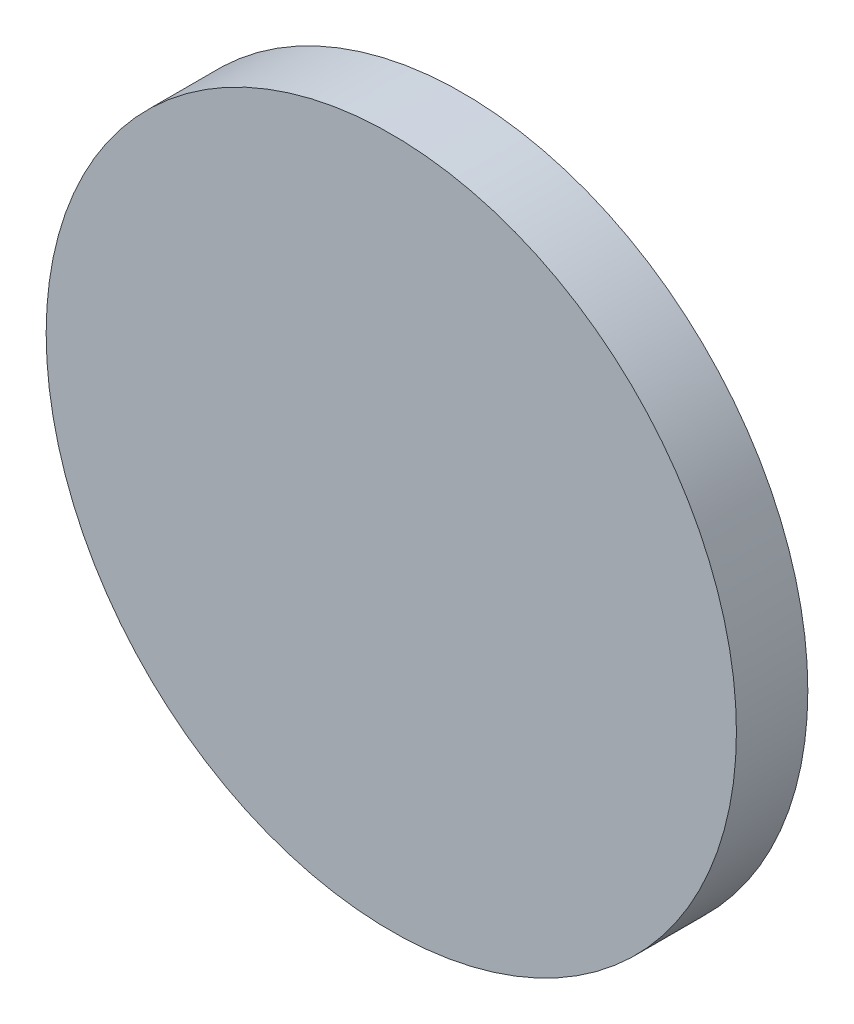
ISO-10303-21;
HEADER;
FILE_DESCRIPTION(('STEP AP214'),'2;1');
FILE_NAME('part.step','',(''),(''),'','','');
FILE_SCHEMA(('AUTOMOTIVE_DESIGN { 1 0 10303 214 1 1 1 1 }'));
ENDSEC;
DATA;
#1=APPLICATION_CONTEXT('core data for automotive mechanical design processes');
#2=APPLICATION_PROTOCOL_DEFINITION('international standard','automotive_design',2000,#1);
#3=PRODUCT_CONTEXT('',#1,'mechanical');
#4=PRODUCT('Part','Part','',(#3));
#5=PRODUCT_RELATED_PRODUCT_CATEGORY('part','',(#4));
#6=PRODUCT_DEFINITION_FORMATION('','',#4);
#7=PRODUCT_DEFINITION_CONTEXT('part definition',#1,'design');
#8=PRODUCT_DEFINITION('design','',#6,#7);
#9=PRODUCT_DEFINITION_SHAPE('','',#8);
#10=(LENGTH_UNIT() NAMED_UNIT(*) SI_UNIT(.MILLI.,.METRE.));
#11=(NAMED_UNIT(*) PLANE_ANGLE_UNIT() SI_UNIT($,.RADIAN.));
#12=(NAMED_UNIT(*) SI_UNIT($,.STERADIAN.) SOLID_ANGLE_UNIT());
#13=UNCERTAINTY_MEASURE_WITH_UNIT(LENGTH_MEASURE(1.E-05),#10,'distance_accuracy_value','');
#14=(GEOMETRIC_REPRESENTATION_CONTEXT(3) GLOBAL_UNCERTAINTY_ASSIGNED_CONTEXT((#13)) GLOBAL_UNIT_ASSIGNED_CONTEXT((#10,
#11,#12)) REPRESENTATION_CONTEXT('',''));
#15=CARTESIAN_POINT('',(0.,0.,0.));
#16=DIRECTION('',(0.,0.,1.));
#17=DIRECTION('',(1.,0.,0.));
#18=AXIS2_PLACEMENT_3D('',#15,#16,#17);
#19=CARTESIAN_POINT('',(0.,0.,3.));
#20=DIRECTION('',(0.,0.,-1.));
#21=DIRECTION('',(-1.,0.,0.));
#22=AXIS2_PLACEMENT_3D('',#19,#20,#21);
#23=CYLINDRICAL_SURFACE('',#22,14.5);
#24=CARTESIAN_POINT('',(0.,0.,3.));
#25=DIRECTION('',(0.,0.,1.));
#26=DIRECTION('',(1.,0.,0.));
#27=AXIS2_PLACEMENT_3D('',#24,#25,#26);
#28=CIRCLE('',#27,14.5);
#29=CARTESIAN_POINT('',(14.5,0.,3.));
#30=VERTEX_POINT('',#29);
#31=EDGE_CURVE('E10',#30,#30,#28,.T.);
#32=ORIENTED_EDGE('',*,*,#31,.F.);
#33=EDGE_LOOP('',(#32));
#34=FACE_BOUND('',#33,.T.);
#35=CARTESIAN_POINT('',(0.,0.,0.));
#36=DIRECTION('',(0.,0.,1.));
#37=DIRECTION('',(1.,0.,0.));
#38=AXIS2_PLACEMENT_3D('',#35,#36,#37);
#39=CIRCLE('',#38,14.5);
#40=CARTESIAN_POINT('',(14.5,0.,0.));
#41=VERTEX_POINT('',#40);
#42=EDGE_CURVE('E48',#41,#41,#39,.T.);
#43=ORIENTED_EDGE('',*,*,#42,.T.);
#44=EDGE_LOOP('',(#43));
#45=FACE_BOUND('',#44,.T.);
#46=ADVANCED_FACE('F45',(#34,#45),#23,.T.);
#47=CARTESIAN_POINT('',(0.,0.,3.));
#48=DIRECTION('',(0.,0.,1.));
#49=DIRECTION('',(1.,0.,0.));
#50=AXIS2_PLACEMENT_3D('',#47,#48,#49);
#51=PLANE('',#50);
#52=ORIENTED_EDGE('',*,*,#31,.T.);
#53=EDGE_LOOP('',(#52));
#54=FACE_BOUND('',#53,.T.);
#55=ADVANCED_FACE('F64',(#54),#51,.T.);
#56=CARTESIAN_POINT('',(0.,0.,0.));
#57=DIRECTION('',(0.,0.,1.));
#58=DIRECTION('',(1.,0.,0.));
#59=AXIS2_PLACEMENT_3D('',#56,#57,#58);
#60=PLANE('',#59);
#61=ORIENTED_EDGE('',*,*,#42,.F.);
#62=EDGE_LOOP('',(#61));
#63=FACE_BOUND('',#62,.T.);
#64=ADVANCED_FACE('F62',(#63),#60,.F.);
#65=CLOSED_SHELL('',(#46,#55,#64));
#66=MANIFOLD_SOLID_BREP('B2',#65);
#67=ADVANCED_BREP_SHAPE_REPRESENTATION('',(#18,#66),#14);
#68=SHAPE_DEFINITION_REPRESENTATION(#9,#67);
ENDSEC;
END-ISO-10303-21;
